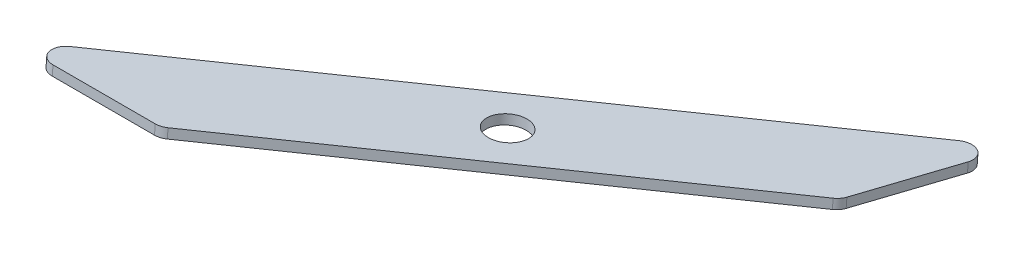
ISO-10303-21;
HEADER;
FILE_DESCRIPTION(('STEP AP214'),'2;1');
FILE_NAME('part.step','',(''),(''),'','','');
FILE_SCHEMA(('AUTOMOTIVE_DESIGN { 1 0 10303 214 1 1 1 1 }'));
ENDSEC;
DATA;
#1=APPLICATION_CONTEXT('core data for automotive mechanical design processes');
#2=APPLICATION_PROTOCOL_DEFINITION('international standard','automotive_design',2000,#1);
#3=PRODUCT_CONTEXT('',#1,'mechanical');
#4=PRODUCT('Part','Part','',(#3));
#5=PRODUCT_RELATED_PRODUCT_CATEGORY('part','',(#4));
#6=PRODUCT_DEFINITION_FORMATION('','',#4);
#7=PRODUCT_DEFINITION_CONTEXT('part definition',#1,'design');
#8=PRODUCT_DEFINITION('design','',#6,#7);
#9=PRODUCT_DEFINITION_SHAPE('','',#8);
#10=(LENGTH_UNIT() NAMED_UNIT(*) SI_UNIT(.MILLI.,.METRE.));
#11=(NAMED_UNIT(*) PLANE_ANGLE_UNIT() SI_UNIT($,.RADIAN.));
#12=(NAMED_UNIT(*) SI_UNIT($,.STERADIAN.) SOLID_ANGLE_UNIT());
#13=UNCERTAINTY_MEASURE_WITH_UNIT(LENGTH_MEASURE(1.E-05),#10,'distance_accuracy_value','');
#14=(GEOMETRIC_REPRESENTATION_CONTEXT(3) GLOBAL_UNCERTAINTY_ASSIGNED_CONTEXT((#13)) GLOBAL_UNIT_ASSIGNED_CONTEXT((#10,
#11,#12)) REPRESENTATION_CONTEXT('',''));
#15=CARTESIAN_POINT('',(0.,0.,0.));
#16=DIRECTION('',(0.,0.,1.));
#17=DIRECTION('',(1.,0.,0.));
#18=AXIS2_PLACEMENT_3D('',#15,#16,#17);
#19=CARTESIAN_POINT('',(-7.27753292827866E-13,53.77819788359,-4.47708887821313));
#20=DIRECTION('',(0.,-0.996552545023082,0.0829639982644206));
#21=DIRECTION('',(0.,-0.0829639982644207,-0.996552545023082));
#22=AXIS2_PLACEMENT_3D('',#19,#20,#21);
#23=PLANE('',#22);
#24=DIRECTION('',(-1.,0.,0.));
#25=VECTOR('',#24,1.);
#26=CARTESIAN_POINT('',(147.350181938245,106.629089666265,630.360814484378));
#27=LINE('',#26,#25);
#28=CARTESIAN_POINT('',(146.454230026925,106.629089666265,630.360814484378));
#29=VERTEX_POINT('',#28);
#30=CARTESIAN_POINT('',(129.248562302514,106.629089666265,630.360814484378));
#31=VERTEX_POINT('',#30);
#32=EDGE_CURVE('E177',#29,#31,#27,.T.);
#33=ORIENTED_EDGE('',*,*,#32,.T.);
#34=CARTESIAN_POINT('',(129.248562302514,106.418361110673,627.829571020019));
#35=DIRECTION('',(0.,-0.996552545023082,0.0829639982644206));
#36=DIRECTION('',(0.,-0.0829639982644207,-0.996552545023082));
#37=AXIS2_PLACEMENT_3D('',#34,#35,#36);
#38=CIRCLE('',#37,2.54);
#39=CARTESIAN_POINT('',(127.654942081597,106.254269005611,625.8585184148));
#40=VERTEX_POINT('',#39);
#41=EDGE_CURVE('E154',#31,#40,#38,.T.);
#42=ORIENTED_EDGE('',*,*,#41,.T.);
#43=DIRECTION('',(0.77868945953739,-0.0520524036386922,-0.625246569667361));
#44=VECTOR('',#43,1.);
#45=CARTESIAN_POINT('',(122.047729402347,106.629089666265,630.360814484378));
#46=LINE('',#45,#44);
#47=CARTESIAN_POINT('',(210.593855238859,100.710120780488,559.262945162371));
#48=VERTEX_POINT('',#47);
#49=EDGE_CURVE('E125',#40,#48,#46,.T.);
#50=ORIENTED_EDGE('',*,*,#49,.T.);
#51=CARTESIAN_POINT('',(212.187475459776,100.87421288555,561.23399776759));
#52=DIRECTION('',(0.,-0.996552545023082,0.0829639982644206));
#53=DIRECTION('',(0.,-0.0829639982644207,-0.996552545023082));
#54=AXIS2_PLACEMENT_3D('',#51,#52,#53);
#55=CIRCLE('',#54,2.54);
#56=CARTESIAN_POINT('',(214.669345996843,100.91903791517,561.772430078987));
#57=VERTEX_POINT('',#56);
#58=EDGE_CURVE('E149',#48,#57,#55,.T.);
#59=ORIENTED_EDGE('',*,*,#58,.T.);
#60=DIRECTION('',(-0.212714548789269,0.0810653161140839,0.973745826823767));
#61=VECTOR('',#60,1.);
#62=CARTESIAN_POINT('',(216.201067918109,100.335300119833,554.760649092794));
#63=LINE('',#62,#61);
#64=CARTESIAN_POINT('',(211.009450150227,102.313820808203,578.526377223348));
#65=VERTEX_POINT('',#64);
#66=EDGE_CURVE('E132',#57,#65,#63,.T.);
#67=ORIENTED_EDGE('',*,*,#66,.T.);
#68=CARTESIAN_POINT('',(208.52757961316,102.268995778584,577.987944911951));
#69=DIRECTION('',(0.,-0.996552545023082,0.0829639982644206));
#70=DIRECTION('',(0.,-0.0829639982644207,-0.996552545023082));
#71=AXIS2_PLACEMENT_3D('',#68,#69,#70);
#72=CIRCLE('',#71,2.54);
#73=CARTESIAN_POINT('',(210.121199834077,102.433087883646,579.95899751717));
#74=VERTEX_POINT('',#73);
#75=EDGE_CURVE('E61',#65,#74,#72,.T.);
#76=ORIENTED_EDGE('',*,*,#75,.T.);
#77=DIRECTION('',(-0.77868945953739,0.0520524036386922,0.625246569667361));
#78=VECTOR('',#77,1.);
#79=CARTESIAN_POINT('',(210.818868143674,102.386451433117,579.398806658031));
#80=LINE('',#79,#78);
#81=CARTESIAN_POINT('',(148.047850247842,106.582453215736,629.800623625238));
#82=VERTEX_POINT('',#81);
#83=EDGE_CURVE('E135',#74,#82,#80,.T.);
#84=ORIENTED_EDGE('',*,*,#83,.T.);
#85=CARTESIAN_POINT('',(146.454230026925,106.418361110674,627.829571020019));
#86=DIRECTION('',(0.,-0.996552545023082,0.0829639982644206));
#87=DIRECTION('',(0.,-0.0829639982644207,-0.996552545023082));
#88=AXIS2_PLACEMENT_3D('',#85,#86,#87);
#89=CIRCLE('',#88,2.54);
#90=EDGE_CURVE('E152',#82,#29,#89,.T.);
#91=ORIENTED_EDGE('',*,*,#90,.T.);
#92=EDGE_LOOP('',(#33,#42,#50,#59,#67,#76,#84,#91));
#93=FACE_BOUND('',#92,.T.);
#94=CARTESIAN_POINT('',(174.104461850594,103.99498272137,598.720271179895));
#95=DIRECTION('',(0.,-0.996552545023082,0.0829639982644206));
#96=DIRECTION('',(0.,-0.0829639982644206,-0.996552545023082));
#97=AXIS2_PLACEMENT_3D('',#94,#95,#96);
#98=CIRCLE('',#97,3.26389999999998);
#99=CARTESIAN_POINT('',(174.104461850594,104.265768915305,601.972919031596));
#100=VERTEX_POINT('',#99);
#101=EDGE_CURVE('E170',#100,#100,#98,.T.);
#102=ORIENTED_EDGE('',*,*,#101,.F.);
#103=EDGE_LOOP('',(#102));
#104=FACE_BOUND('',#103,.T.);
#105=ADVANCED_FACE('F39',(#93,#104),#23,.T.);
#106=CARTESIAN_POINT('',(-7.48952611170302E-13,55.3602250488142,-4.6087942254579));
#107=DIRECTION('',(0.,-0.996552545023082,0.0829639982644206));
#108=DIRECTION('',(0.,-0.0829639982644207,-0.996552545023082));
#109=AXIS2_PLACEMENT_3D('',#106,#107,#108);
#110=PLANE('',#109);
#111=DIRECTION('',(0.77868945953739,-0.0520524036386922,-0.625246569667361));
#112=VECTOR('',#111,1.);
#113=CARTESIAN_POINT('',(122.047729402347,108.211116831489,630.229109137133));
#114=LINE('',#113,#112);
#115=CARTESIAN_POINT('',(127.654942081597,107.836296170835,625.726813067556));
#116=VERTEX_POINT('',#115);
#117=CARTESIAN_POINT('',(210.593855238859,102.292147945712,559.131239815126));
#118=VERTEX_POINT('',#117);
#119=EDGE_CURVE('E122',#116,#118,#114,.T.);
#120=ORIENTED_EDGE('',*,*,#119,.F.);
#121=CARTESIAN_POINT('',(129.248562302514,108.000388275897,627.697865672775));
#122=DIRECTION('',(0.,-0.996552545023082,0.0829639982644206));
#123=DIRECTION('',(0.,-0.0829639982644207,-0.996552545023082));
#124=AXIS2_PLACEMENT_3D('',#121,#122,#123);
#125=CIRCLE('',#124,2.54);
#126=CARTESIAN_POINT('',(129.248562302514,108.211116831489,630.229109137133));
#127=VERTEX_POINT('',#126);
#128=EDGE_CURVE('E105',#116,#127,#125,.F.);
#129=ORIENTED_EDGE('',*,*,#128,.T.);
#130=DIRECTION('',(-1.,0.,0.));
#131=VECTOR('',#130,1.);
#132=CARTESIAN_POINT('',(147.350181938245,108.211116831489,630.229109137133));
#133=LINE('',#132,#131);
#134=CARTESIAN_POINT('',(146.454230026925,108.211116831489,630.229109137133));
#135=VERTEX_POINT('',#134);
#136=EDGE_CURVE('E133',#135,#127,#133,.T.);
#137=ORIENTED_EDGE('',*,*,#136,.F.);
#138=CARTESIAN_POINT('',(146.454230026925,108.000388275898,627.697865672775));
#139=DIRECTION('',(0.,-0.996552545023082,0.0829639982644206));
#140=DIRECTION('',(0.,-0.0829639982644207,-0.996552545023082));
#141=AXIS2_PLACEMENT_3D('',#138,#139,#140);
#142=CIRCLE('',#141,2.54);
#143=CARTESIAN_POINT('',(148.047850247842,108.16448038096,629.668918277993));
#144=VERTEX_POINT('',#143);
#145=EDGE_CURVE('E116',#135,#144,#142,.F.);
#146=ORIENTED_EDGE('',*,*,#145,.T.);
#147=DIRECTION('',(-0.77868945953739,0.0520524036386922,0.625246569667361));
#148=VECTOR('',#147,1.);
#149=CARTESIAN_POINT('',(210.818868143674,103.968478598342,579.267101310786));
#150=LINE('',#149,#148);
#151=CARTESIAN_POINT('',(210.121199834077,104.01511504887,579.827292169926));
#152=VERTEX_POINT('',#151);
#153=EDGE_CURVE('E137',#152,#144,#150,.T.);
#154=ORIENTED_EDGE('',*,*,#153,.F.);
#155=CARTESIAN_POINT('',(208.52757961316,103.851022943808,577.856239564707));
#156=DIRECTION('',(0.,-0.996552545023082,0.0829639982644206));
#157=DIRECTION('',(0.,-0.0829639982644207,-0.996552545023082));
#158=AXIS2_PLACEMENT_3D('',#155,#156,#157);
#159=CIRCLE('',#158,2.54);
#160=CARTESIAN_POINT('',(211.009450150227,103.895847973427,578.394671876103));
#161=VERTEX_POINT('',#160);
#162=EDGE_CURVE('E143',#152,#161,#159,.F.);
#163=ORIENTED_EDGE('',*,*,#162,.T.);
#164=DIRECTION('',(-0.212714548789269,0.0810653161140839,0.973745826823767));
#165=VECTOR('',#164,1.);
#166=CARTESIAN_POINT('',(216.201067918109,101.917327285057,554.628943745549));
#167=LINE('',#166,#165);
#168=CARTESIAN_POINT('',(214.669345996843,102.501065080394,561.640724731742));
#169=VERTEX_POINT('',#168);
#170=EDGE_CURVE('E165',#169,#161,#167,.T.);
#171=ORIENTED_EDGE('',*,*,#170,.F.);
#172=CARTESIAN_POINT('',(212.187475459776,102.456240050774,561.102292420346));
#173=DIRECTION('',(0.,-0.996552545023082,0.0829639982644206));
#174=DIRECTION('',(0.,-0.0829639982644207,-0.996552545023082));
#175=AXIS2_PLACEMENT_3D('',#172,#173,#174);
#176=CIRCLE('',#175,2.54);
#177=EDGE_CURVE('E126',#169,#118,#176,.F.);
#178=ORIENTED_EDGE('',*,*,#177,.T.);
#179=EDGE_LOOP('',(#120,#129,#137,#146,#154,#163,#171,#178));
#180=FACE_BOUND('',#179,.T.);
#181=CARTESIAN_POINT('',(174.104461850594,105.577009886594,598.58856583265));
#182=DIRECTION('',(0.,-0.996552545023082,0.0829639982644206));
#183=DIRECTION('',(0.,-0.0829639982644206,-0.996552545023082));
#184=AXIS2_PLACEMENT_3D('',#181,#182,#183);
#185=CIRCLE('',#184,3.26389999999998);
#186=CARTESIAN_POINT('',(174.104461850594,105.84779608053,601.841213684351));
#187=VERTEX_POINT('',#186);
#188=EDGE_CURVE('E173',#187,#187,#185,.T.);
#189=ORIENTED_EDGE('',*,*,#188,.T.);
#190=EDGE_LOOP('',(#189));
#191=FACE_BOUND('',#190,.T.);
#192=ADVANCED_FACE('F129',(#180,#191),#110,.F.);
#193=CARTESIAN_POINT('',(216.201067918109,100.335300119833,554.760649092794));
#194=DIRECTION('',(-0.977114384672223,-0.0176476494565829,-0.211981224959381));
#195=DIRECTION('',(-0.212014242338447,0.,0.977266576245015));
#196=AXIS2_PLACEMENT_3D('',#193,#194,#195);
#197=PLANE('',#196);
#198=ORIENTED_EDGE('',*,*,#170,.T.);
#199=DIRECTION('',(0.,0.996552545023082,-0.0829639982644206));
#200=VECTOR('',#199,1.);
#201=CARTESIAN_POINT('',(211.009450150227,102.313820808203,578.526377223348));
#202=LINE('',#201,#200);
#203=EDGE_CURVE('E11',#161,#65,#202,.F.);
#204=ORIENTED_EDGE('',*,*,#203,.T.);
#205=ORIENTED_EDGE('',*,*,#66,.F.);
#206=DIRECTION('',(0.,0.996552545023082,-0.0829639982644206));
#207=VECTOR('',#206,1.);
#208=CARTESIAN_POINT('',(214.669345996843,100.91903791517,561.772430078987));
#209=LINE('',#208,#207);
#210=EDGE_CURVE('E47',#57,#169,#209,.T.);
#211=ORIENTED_EDGE('',*,*,#210,.T.);
#212=EDGE_LOOP('',(#198,#204,#205,#211));
#213=FACE_BOUND('',#212,.T.);
#214=ADVANCED_FACE('F164',(#213),#197,.F.);
#215=CARTESIAN_POINT('',(210.818868143674,102.386451433117,579.398806658031));
#216=DIRECTION('',(-0.627409535794099,-0.064603190969591,-0.776004962684634));
#217=DIRECTION('',(-0.777629405656479,0.,0.628722917872692));
#218=AXIS2_PLACEMENT_3D('',#215,#216,#217);
#219=PLANE('',#218);
#220=ORIENTED_EDGE('',*,*,#153,.T.);
#221=DIRECTION('',(0.,0.996552545023082,-0.0829639982644206));
#222=VECTOR('',#221,1.);
#223=CARTESIAN_POINT('',(148.047850247842,106.582453215736,629.800623625238));
#224=LINE('',#223,#222);
#225=EDGE_CURVE('E54',#144,#82,#224,.F.);
#226=ORIENTED_EDGE('',*,*,#225,.T.);
#227=ORIENTED_EDGE('',*,*,#83,.F.);
#228=DIRECTION('',(0.,0.996552545023082,-0.0829639982644206));
#229=VECTOR('',#228,1.);
#230=CARTESIAN_POINT('',(210.121199834077,102.433087883646,579.95899751717));
#231=LINE('',#230,#229);
#232=EDGE_CURVE('E156',#74,#152,#231,.T.);
#233=ORIENTED_EDGE('',*,*,#232,.T.);
#234=EDGE_LOOP('',(#220,#226,#227,#233));
#235=FACE_BOUND('',#234,.T.);
#236=ADVANCED_FACE('F206',(#235),#219,.F.);
#237=CARTESIAN_POINT('',(147.350181938245,106.629089666265,630.360814484378));
#238=DIRECTION('',(0.,-0.0829639982644206,-0.996552545023082));
#239=DIRECTION('',(0.,0.996552545023082,-0.0829639982644206));
#240=AXIS2_PLACEMENT_3D('',#237,#238,#239);
#241=PLANE('',#240);
#242=ORIENTED_EDGE('',*,*,#136,.T.);
#243=DIRECTION('',(0.,0.996552545023082,-0.0829639982644206));
#244=VECTOR('',#243,1.);
#245=CARTESIAN_POINT('',(129.248562302514,106.629089666265,630.360814484378));
#246=LINE('',#245,#244);
#247=EDGE_CURVE('E110',#127,#31,#246,.F.);
#248=ORIENTED_EDGE('',*,*,#247,.T.);
#249=ORIENTED_EDGE('',*,*,#32,.F.);
#250=DIRECTION('',(0.,0.996552545023082,-0.0829639982644206));
#251=VECTOR('',#250,1.);
#252=CARTESIAN_POINT('',(146.454230026925,106.629089666265,630.360814484378));
#253=LINE('',#252,#251);
#254=EDGE_CURVE('E115',#29,#135,#253,.T.);
#255=ORIENTED_EDGE('',*,*,#254,.T.);
#256=EDGE_LOOP('',(#242,#248,#249,#255));
#257=FACE_BOUND('',#256,.T.);
#258=ADVANCED_FACE('F195',(#257),#241,.F.);
#259=CARTESIAN_POINT('',(122.047729402347,106.629089666265,630.360814484378));
#260=DIRECTION('',(0.627409535794099,0.064603190969591,0.776004962684634));
#261=DIRECTION('',(0.777629405656479,0.,-0.628722917872692));
#262=AXIS2_PLACEMENT_3D('',#259,#260,#261);
#263=PLANE('',#262);
#264=ORIENTED_EDGE('',*,*,#49,.F.);
#265=DIRECTION('',(0.,0.996552545023082,-0.0829639982644206));
#266=VECTOR('',#265,1.);
#267=CARTESIAN_POINT('',(127.654942081597,106.254269005611,625.8585184148));
#268=LINE('',#267,#266);
#269=EDGE_CURVE('E109',#40,#116,#268,.T.);
#270=ORIENTED_EDGE('',*,*,#269,.T.);
#271=ORIENTED_EDGE('',*,*,#119,.T.);
#272=DIRECTION('',(0.,0.996552545023082,-0.0829639982644206));
#273=VECTOR('',#272,1.);
#274=CARTESIAN_POINT('',(210.593855238859,100.710120780488,559.262945162371));
#275=LINE('',#274,#273);
#276=EDGE_CURVE('E127',#118,#48,#275,.F.);
#277=ORIENTED_EDGE('',*,*,#276,.T.);
#278=EDGE_LOOP('',(#264,#270,#271,#277));
#279=FACE_BOUND('',#278,.T.);
#280=ADVANCED_FACE('F121',(#279),#263,.F.);
#281=CARTESIAN_POINT('',(174.104461850594,103.99498272137,598.720271179895));
#282=DIRECTION('',(0.,0.996552545023082,-0.0829639982644206));
#283=DIRECTION('',(0.,0.0829639982644206,0.996552545023082));
#284=AXIS2_PLACEMENT_3D('',#281,#282,#283);
#285=CYLINDRICAL_SURFACE('',#284,3.26389999999998);
#286=CARTESIAN_POINT('',(174.104461850594,104.265768915305,601.972919031596));
#287=CARTESIAN_POINT('',(174.104461850594,104.282248364943,601.971547100895));
#288=CARTESIAN_POINT('',(174.104461850594,104.298727814581,601.970175170195));
#289=CARTESIAN_POINT('',(174.104461850594,104.331686713856,601.967431308794));
#290=CARTESIAN_POINT('',(174.104461850594,104.348166163494,601.966059378094));
#291=CARTESIAN_POINT('',(174.104461850594,104.38112506277,601.963315516693));
#292=CARTESIAN_POINT('',(174.104461850594,104.397604512407,601.961943585992));
#293=CARTESIAN_POINT('',(174.104461850594,104.430563411683,601.959199724591));
#294=CARTESIAN_POINT('',(174.104461850594,104.447042861321,601.957827793891));
#295=CARTESIAN_POINT('',(174.104461850594,104.480001760596,601.95508393249));
#296=CARTESIAN_POINT('',(174.104461850594,104.496481210234,601.953712001789));
#297=CARTESIAN_POINT('',(174.104461850594,104.529440109509,601.950968140388));
#298=CARTESIAN_POINT('',(174.104461850594,104.545919559147,601.949596209688));
#299=CARTESIAN_POINT('',(174.104461850594,104.578878458423,601.946852348287));
#300=CARTESIAN_POINT('',(174.104461850594,104.59535790806,601.945480417587));
#301=CARTESIAN_POINT('',(174.104461850594,104.628316807336,601.942736556186));
#302=CARTESIAN_POINT('',(174.104461850594,104.644796256974,601.941364625485));
#303=CARTESIAN_POINT('',(174.104461850594,104.677755156249,601.938620764084));
#304=CARTESIAN_POINT('',(174.104461850594,104.694234605887,601.937248833384));
#305=CARTESIAN_POINT('',(174.104461850594,104.727193505162,601.934504971983));
#306=CARTESIAN_POINT('',(174.104461850594,104.7436729548,601.933133041282));
#307=CARTESIAN_POINT('',(174.104461850594,104.776631854076,601.930389179881));
#308=CARTESIAN_POINT('',(174.104461850594,104.793111303713,601.929017249181));
#309=CARTESIAN_POINT('',(174.104461850594,104.826070202989,601.92627338778));
#310=CARTESIAN_POINT('',(174.104461850594,104.842549652627,601.924901457079));
#311=CARTESIAN_POINT('',(174.104461850594,104.875508551902,601.922157595679));
#312=CARTESIAN_POINT('',(174.104461850594,104.89198800154,601.920785664978));
#313=CARTESIAN_POINT('',(174.104461850594,104.924946900816,601.918041803577));
#314=CARTESIAN_POINT('',(174.104461850594,104.941426350453,601.916669872877));
#315=CARTESIAN_POINT('',(174.104461850594,104.974385249729,601.913926011476));
#316=CARTESIAN_POINT('',(174.104461850594,104.990864699367,601.912554080775));
#317=CARTESIAN_POINT('',(174.104461850594,105.023823598642,601.909810219374));
#318=CARTESIAN_POINT('',(174.104461850594,105.04030304828,601.908438288674));
#319=CARTESIAN_POINT('',(174.104461850594,105.073261947555,601.905694427273));
#320=CARTESIAN_POINT('',(174.104461850594,105.089741397193,601.904322496573));
#321=CARTESIAN_POINT('',(174.104461850594,105.122700296469,601.901578635172));
#322=CARTESIAN_POINT('',(174.104461850594,105.139179746106,601.900206704471));
#323=CARTESIAN_POINT('',(174.104461850594,105.172138645382,601.89746284307));
#324=CARTESIAN_POINT('',(174.104461850594,105.18861809502,601.89609091237));
#325=CARTESIAN_POINT('',(174.104461850594,105.221576994295,601.893347050969));
#326=CARTESIAN_POINT('',(174.104461850594,105.238056443933,601.891975120268));
#327=CARTESIAN_POINT('',(174.104461850594,105.271015343208,601.889231258867));
#328=CARTESIAN_POINT('',(174.104461850594,105.287494792846,601.887859328167));
#329=CARTESIAN_POINT('',(174.104461850594,105.320453692122,601.885115466766));
#330=CARTESIAN_POINT('',(174.104461850594,105.336933141759,601.883743536066));
#331=CARTESIAN_POINT('',(174.104461850594,105.369892041035,601.880999674665));
#332=CARTESIAN_POINT('',(174.104461850594,105.386371490673,601.879627743964));
#333=CARTESIAN_POINT('',(174.104461850594,105.419330389948,601.876883882563));
#334=CARTESIAN_POINT('',(174.104461850594,105.435809839586,601.875511951863));
#335=CARTESIAN_POINT('',(174.104461850594,105.468768738861,601.872768090462));
#336=CARTESIAN_POINT('',(174.104461850594,105.485248188499,601.871396159761));
#337=CARTESIAN_POINT('',(174.104461850594,105.518207087775,601.86865229836));
#338=CARTESIAN_POINT('',(174.104461850594,105.534686537412,601.86728036766));
#339=CARTESIAN_POINT('',(174.104461850594,105.567645436688,601.864536506259));
#340=CARTESIAN_POINT('',(174.104461850594,105.584124886326,601.863164575559));
#341=CARTESIAN_POINT('',(174.104461850594,105.617083785601,601.860420714158));
#342=CARTESIAN_POINT('',(174.104461850594,105.633563235239,601.859048783457));
#343=CARTESIAN_POINT('',(174.104461850594,105.666522134514,601.856304922056));
#344=CARTESIAN_POINT('',(174.104461850594,105.683001584152,601.854932991356));
#345=CARTESIAN_POINT('',(174.104461850594,105.715960483428,601.852189129955));
#346=CARTESIAN_POINT('',(174.104461850594,105.732439933065,601.850817199254));
#347=CARTESIAN_POINT('',(174.104461850594,105.765398832341,601.848073337853));
#348=CARTESIAN_POINT('',(174.104461850594,105.781878281979,601.846701407153));
#349=CARTESIAN_POINT('',(174.104461850594,105.814837181254,601.843957545752));
#350=CARTESIAN_POINT('',(174.104461850594,105.831316630892,601.842585615052));
#351=CARTESIAN_POINT('',(174.104461850594,105.84779608053,601.841213684351));
#352=B_SPLINE_CURVE_WITH_KNOTS('',3,(#286,#287,#288,#289,#290,#291,#292,#293,#294,#295,#296,
#297,#298,#299,#300,#301,#302,#303,#304,#305,#306,#307,#308,#309,#310,#311,#312,#313,#314,#315,
#316,#317,#318,#319,#320,#321,#322,#323,#324,#325,#326,#327,#328,#329,#330,#331,#332,#333,#334,
#335,#336,#337,#338,#339,#340,#341,#342,#343,#344,#345,#346,#347,#348,#349,#350,#351),
.UNSPECIFIED.,.F.,.F.,(4,2,2,2,2,2,2,2,2,2,2,2,2,2,2,2,2,2,2,2,2,2,2,2,2,2,2,2,2,2,2,2,4),(0.,
0.0496093750000002,0.0992187500000096,0.14882812500001,0.198437500000005,0.248046875000006,
0.297656250000006,0.347265625000015,0.396875000000002,0.446484375000011,0.496093750000011,
0.545703124999998,0.595312500000007,0.644921875000007,0.694531250000007,0.744140625000003,
0.793750000000003,0.843359375000013,0.892968749999999,0.942578124999999,0.992187500000009,
1.04179687500001,1.09140625,1.141015625,1.190625,1.240234375,1.28984375,1.33945312500001,
1.38906250000001,1.438671875,1.48828125000001,1.53789062500001,1.58749999999999),.UNSPECIFIED.);
#353=EDGE_CURVE('BSEAM184',#100,#187,#352,.T.);
#354=ORIENTED_EDGE('',*,*,#101,.T.);
#355=ORIENTED_EDGE('',*,*,#188,.F.);
#356=ORIENTED_EDGE('',*,*,#353,.T.);
#357=ORIENTED_EDGE('',*,*,#353,.F.);
#358=EDGE_LOOP('',(#354,#356,#355,#357));
#359=FACE_BOUND('',#358,.T.);
#360=ADVANCED_FACE('F184',(#359),#285,.F.);
#361=CARTESIAN_POINT('',(129.248562302514,106.418361110673,627.829571020019));
#362=DIRECTION('',(0.,0.996552545023082,-0.0829639982644206));
#363=DIRECTION('',(0.,0.0829639982644206,0.996552545023082));
#364=AXIS2_PLACEMENT_3D('',#361,#362,#363);
#365=CYLINDRICAL_SURFACE('',#364,2.54);
#366=ORIENTED_EDGE('',*,*,#41,.F.);
#367=ORIENTED_EDGE('',*,*,#247,.F.);
#368=ORIENTED_EDGE('',*,*,#128,.F.);
#369=ORIENTED_EDGE('',*,*,#269,.F.);
#370=EDGE_LOOP('',(#366,#367,#368,#369));
#371=FACE_BOUND('',#370,.T.);
#372=ADVANCED_FACE('F108',(#371),#365,.T.);
#373=CARTESIAN_POINT('',(146.454230026925,106.418361110674,627.829571020019));
#374=DIRECTION('',(0.,0.996552545023082,-0.0829639982644206));
#375=DIRECTION('',(0.,0.0829639982644206,0.996552545023082));
#376=AXIS2_PLACEMENT_3D('',#373,#374,#375);
#377=CYLINDRICAL_SURFACE('',#376,2.54);
#378=ORIENTED_EDGE('',*,*,#90,.F.);
#379=ORIENTED_EDGE('',*,*,#225,.F.);
#380=ORIENTED_EDGE('',*,*,#145,.F.);
#381=ORIENTED_EDGE('',*,*,#254,.F.);
#382=EDGE_LOOP('',(#378,#379,#380,#381));
#383=FACE_BOUND('',#382,.T.);
#384=ADVANCED_FACE('F192',(#383),#377,.T.);
#385=CARTESIAN_POINT('',(208.52757961316,102.268995778584,577.987944911951));
#386=DIRECTION('',(0.,0.996552545023082,-0.0829639982644206));
#387=DIRECTION('',(0.,0.0829639982644206,0.996552545023082));
#388=AXIS2_PLACEMENT_3D('',#385,#386,#387);
#389=CYLINDRICAL_SURFACE('',#388,2.54);
#390=ORIENTED_EDGE('',*,*,#75,.F.);
#391=ORIENTED_EDGE('',*,*,#203,.F.);
#392=ORIENTED_EDGE('',*,*,#162,.F.);
#393=ORIENTED_EDGE('',*,*,#232,.F.);
#394=EDGE_LOOP('',(#390,#391,#392,#393));
#395=FACE_BOUND('',#394,.T.);
#396=ADVANCED_FACE('F213',(#395),#389,.T.);
#397=CARTESIAN_POINT('',(212.187475459776,100.87421288555,561.23399776759));
#398=DIRECTION('',(0.,0.996552545023082,-0.0829639982644206));
#399=DIRECTION('',(0.,0.0829639982644206,0.996552545023082));
#400=AXIS2_PLACEMENT_3D('',#397,#398,#399);
#401=CYLINDRICAL_SURFACE('',#400,2.54);
#402=ORIENTED_EDGE('',*,*,#58,.F.);
#403=ORIENTED_EDGE('',*,*,#276,.F.);
#404=ORIENTED_EDGE('',*,*,#177,.F.);
#405=ORIENTED_EDGE('',*,*,#210,.F.);
#406=EDGE_LOOP('',(#402,#403,#404,#405));
#407=FACE_BOUND('',#406,.T.);
#408=ADVANCED_FACE('F41',(#407),#401,.T.);
#409=CLOSED_SHELL('',(#105,#192,#214,#236,#258,#280,#360,#372,#384,#396,#408));
#410=MANIFOLD_SOLID_BREP('B2',#409);
#411=ADVANCED_BREP_SHAPE_REPRESENTATION('',(#18,#410),#14);
#412=SHAPE_DEFINITION_REPRESENTATION(#9,#411);
ENDSEC;
END-ISO-10303-21;
